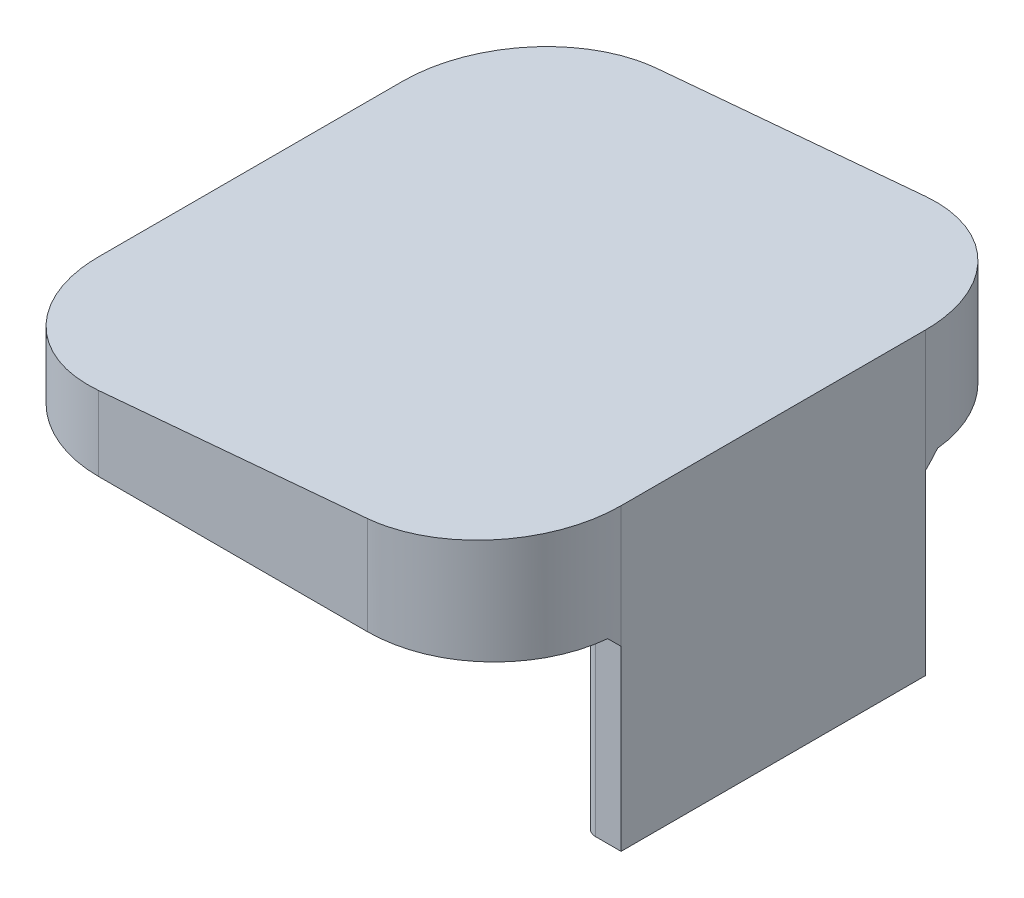
ISO-10303-21;
HEADER;
FILE_DESCRIPTION(('STEP AP214'),'2;1');
FILE_NAME('part.step','',(''),(''),'','','');
FILE_SCHEMA(('AUTOMOTIVE_DESIGN { 1 0 10303 214 1 1 1 1 }'));
ENDSEC;
DATA;
#1=APPLICATION_CONTEXT('core data for automotive mechanical design processes');
#2=APPLICATION_PROTOCOL_DEFINITION('international standard','automotive_design',2000,#1);
#3=PRODUCT_CONTEXT('',#1,'mechanical');
#4=PRODUCT('Part','Part','',(#3));
#5=PRODUCT_RELATED_PRODUCT_CATEGORY('part','',(#4));
#6=PRODUCT_DEFINITION_FORMATION('','',#4);
#7=PRODUCT_DEFINITION_CONTEXT('part definition',#1,'design');
#8=PRODUCT_DEFINITION('design','',#6,#7);
#9=PRODUCT_DEFINITION_SHAPE('','',#8);
#10=(LENGTH_UNIT() NAMED_UNIT(*) SI_UNIT(.MILLI.,.METRE.));
#11=(NAMED_UNIT(*) PLANE_ANGLE_UNIT() SI_UNIT($,.RADIAN.));
#12=(NAMED_UNIT(*) SI_UNIT($,.STERADIAN.) SOLID_ANGLE_UNIT());
#13=UNCERTAINTY_MEASURE_WITH_UNIT(LENGTH_MEASURE(1.E-05),#10,'distance_accuracy_value','');
#14=(GEOMETRIC_REPRESENTATION_CONTEXT(3) GLOBAL_UNCERTAINTY_ASSIGNED_CONTEXT((#13)) GLOBAL_UNIT_ASSIGNED_CONTEXT((#10,
#11,#12)) REPRESENTATION_CONTEXT('',''));
#15=CARTESIAN_POINT('',(0.,0.,0.));
#16=DIRECTION('',(0.,0.,1.));
#17=DIRECTION('',(1.,0.,0.));
#18=AXIS2_PLACEMENT_3D('',#15,#16,#17);
#19=CARTESIAN_POINT('',(-20.6,5.,44.));
#20=DIRECTION('',(1.,0.,0.));
#21=DIRECTION('',(0.,0.,-1.));
#22=AXIS2_PLACEMENT_3D('',#19,#20,#21);
#23=PLANE('',#22);
#24=DIRECTION('',(0.,0.,-1.));
#25=VECTOR('',#24,1.);
#26=CARTESIAN_POINT('',(-20.6,5.,44.));
#27=LINE('',#26,#25);
#28=CARTESIAN_POINT('',(-20.6,5.,34.));
#29=VERTEX_POINT('',#28);
#30=CARTESIAN_POINT('',(-20.6,5.,10.));
#31=VERTEX_POINT('',#30);
#32=EDGE_CURVE('E197',#29,#31,#27,.T.);
#33=ORIENTED_EDGE('',*,*,#32,.T.);
#34=DIRECTION('',(0.,-1.,0.));
#35=VECTOR('',#34,1.);
#36=CARTESIAN_POINT('',(-20.6,5.,10.));
#37=LINE('',#36,#35);
#38=CARTESIAN_POINT('',(-20.6,0.,10.));
#39=VERTEX_POINT('',#38);
#40=EDGE_CURVE('E212',#31,#39,#37,.T.);
#41=ORIENTED_EDGE('',*,*,#40,.T.);
#42=DIRECTION('',(0.,0.,-1.));
#43=VECTOR('',#42,1.);
#44=CARTESIAN_POINT('',(-20.6,0.,44.));
#45=LINE('',#44,#43);
#46=CARTESIAN_POINT('',(-20.6,0.,34.));
#47=VERTEX_POINT('',#46);
#48=EDGE_CURVE('E207',#47,#39,#45,.T.);
#49=ORIENTED_EDGE('',*,*,#48,.F.);
#50=DIRECTION('',(0.,-1.,0.));
#51=VECTOR('',#50,1.);
#52=CARTESIAN_POINT('',(-20.6,5.,34.));
#53=LINE('',#52,#51);
#54=EDGE_CURVE('E210',#47,#29,#53,.F.);
#55=ORIENTED_EDGE('',*,*,#54,.T.);
#56=EDGE_LOOP('',(#33,#41,#49,#55));
#57=FACE_BOUND('',#56,.T.);
#58=ADVANCED_FACE('F45',(#57),#23,.F.);
#59=CARTESIAN_POINT('',(-20.6,0.,44.));
#60=DIRECTION('',(0.,1.,0.));
#61=DIRECTION('',(0.,0.,1.));
#62=AXIS2_PLACEMENT_3D('',#59,#60,#61);
#63=PLANE('',#62);
#64=CARTESIAN_POINT('',(18.6,0.,33.));
#65=DIRECTION('',(0.,1.,0.));
#66=DIRECTION('',(0.,0.,1.));
#67=AXIS2_PLACEMENT_3D('',#64,#65,#66);
#68=CIRCLE('',#67,2.00000000000006);
#69=CARTESIAN_POINT('',(16.5999999999999,0.,33.));
#70=VERTEX_POINT('',#69);
#71=CARTESIAN_POINT('',(18.6,0.,35.0000000000001));
#72=VERTEX_POINT('',#71);
#73=EDGE_CURVE('E263',#70,#72,#68,.T.);
#74=ORIENTED_EDGE('',*,*,#73,.T.);
#75=DIRECTION('',(1.,0.,0.));
#76=VECTOR('',#75,1.);
#77=CARTESIAN_POINT('',(-20.6,0.,35.0000000000001));
#78=LINE('',#77,#76);
#79=CARTESIAN_POINT('',(20.5498743710662,0.,35.0000000000001));
#80=VERTEX_POINT('',#79);
#81=EDGE_CURVE('E265',#72,#80,#78,.T.);
#82=ORIENTED_EDGE('',*,*,#81,.T.);
#83=CARTESIAN_POINT('',(10.6,0.,34.));
#84=DIRECTION('',(0.,1.,0.));
#85=DIRECTION('',(0.,0.,1.));
#86=AXIS2_PLACEMENT_3D('',#83,#84,#85);
#87=CIRCLE('',#86,10.);
#88=CARTESIAN_POINT('',(10.6,0.,44.));
#89=VERTEX_POINT('',#88);
#90=EDGE_CURVE('E215',#80,#89,#87,.F.);
#91=ORIENTED_EDGE('',*,*,#90,.T.);
#92=DIRECTION('',(1.,0.,0.));
#93=VECTOR('',#92,1.);
#94=CARTESIAN_POINT('',(-20.6,0.,44.));
#95=LINE('',#94,#93);
#96=CARTESIAN_POINT('',(-10.6,0.,44.));
#97=VERTEX_POINT('',#96);
#98=EDGE_CURVE('E190',#97,#89,#95,.T.);
#99=ORIENTED_EDGE('',*,*,#98,.F.);
#100=CARTESIAN_POINT('',(-10.6,0.,34.));
#101=DIRECTION('',(0.,1.,0.));
#102=DIRECTION('',(0.,0.,1.));
#103=AXIS2_PLACEMENT_3D('',#100,#101,#102);
#104=CIRCLE('',#103,10.);
#105=EDGE_CURVE('E220',#97,#47,#104,.F.);
#106=ORIENTED_EDGE('',*,*,#105,.T.);
#107=ORIENTED_EDGE('',*,*,#48,.T.);
#108=CARTESIAN_POINT('',(-10.6,0.,10.));
#109=DIRECTION('',(0.,1.,0.));
#110=DIRECTION('',(0.,0.,1.));
#111=AXIS2_PLACEMENT_3D('',#108,#109,#110);
#112=CIRCLE('',#111,10.);
#113=CARTESIAN_POINT('',(-10.6,0.,0.));
#114=VERTEX_POINT('',#113);
#115=EDGE_CURVE('E222',#39,#114,#112,.F.);
#116=ORIENTED_EDGE('',*,*,#115,.T.);
#117=DIRECTION('',(1.,0.,0.));
#118=VECTOR('',#117,1.);
#119=CARTESIAN_POINT('',(-20.6,0.,0.));
#120=LINE('',#119,#118);
#121=CARTESIAN_POINT('',(10.6,0.,0.));
#122=VERTEX_POINT('',#121);
#123=EDGE_CURVE('E180',#114,#122,#120,.T.);
#124=ORIENTED_EDGE('',*,*,#123,.T.);
#125=CARTESIAN_POINT('',(10.6,0.,10.));
#126=DIRECTION('',(0.,1.,0.));
#127=DIRECTION('',(0.,0.,1.));
#128=AXIS2_PLACEMENT_3D('',#125,#126,#127);
#129=CIRCLE('',#128,10.);
#130=CARTESIAN_POINT('',(20.5498743710662,0.,8.99999999999993));
#131=VERTEX_POINT('',#130);
#132=EDGE_CURVE('E217',#122,#131,#129,.F.);
#133=ORIENTED_EDGE('',*,*,#132,.T.);
#134=DIRECTION('',(-1.,0.,0.));
#135=VECTOR('',#134,1.);
#136=CARTESIAN_POINT('',(18.6,0.,8.99999999999993));
#137=LINE('',#136,#135);
#138=CARTESIAN_POINT('',(18.6,0.,8.99999999999993));
#139=VERTEX_POINT('',#138);
#140=EDGE_CURVE('E257',#131,#139,#137,.T.);
#141=ORIENTED_EDGE('',*,*,#140,.T.);
#142=CARTESIAN_POINT('',(18.6,0.,11.));
#143=DIRECTION('',(0.,1.,0.));
#144=DIRECTION('',(0.,0.,1.));
#145=AXIS2_PLACEMENT_3D('',#142,#143,#144);
#146=CIRCLE('',#145,2.00000000000006);
#147=CARTESIAN_POINT('',(16.5999999999999,0.,11.));
#148=VERTEX_POINT('',#147);
#149=EDGE_CURVE('E259',#139,#148,#146,.T.);
#150=ORIENTED_EDGE('',*,*,#149,.T.);
#151=DIRECTION('',(0.,0.,1.));
#152=VECTOR('',#151,1.);
#153=CARTESIAN_POINT('',(16.5999999999999,0.,44.));
#154=LINE('',#153,#152);
#155=EDGE_CURVE('E261',#148,#70,#154,.T.);
#156=ORIENTED_EDGE('',*,*,#155,.T.);
#157=EDGE_LOOP('',(#74,#82,#91,#99,#106,#107,#116,#124,#133,#141,#150,#156));
#158=FACE_BOUND('',#157,.T.);
#159=ADVANCED_FACE('F316',(#158),#63,.F.);
#160=CARTESIAN_POINT('',(20.6,0.,44.));
#161=DIRECTION('',(-1.,0.,0.));
#162=DIRECTION('',(0.,0.,1.));
#163=AXIS2_PLACEMENT_3D('',#160,#161,#162);
#164=PLANE('',#163);
#165=DIRECTION('',(0.,1.,0.));
#166=VECTOR('',#165,1.);
#167=CARTESIAN_POINT('',(20.6,0.,34.));
#168=LINE('',#167,#166);
#169=CARTESIAN_POINT('',(20.6,8.60453293726822,34.));
#170=VERTEX_POINT('',#169);
#171=CARTESIAN_POINT('',(20.6,-1.00000000000007,34.));
#172=VERTEX_POINT('',#171);
#173=EDGE_CURVE('E63',#170,#172,#168,.F.);
#174=ORIENTED_EDGE('',*,*,#173,.T.);
#175=DIRECTION('',(0.,1.,0.));
#176=VECTOR('',#175,1.);
#177=CARTESIAN_POINT('',(20.6,-15.0000000000001,34.));
#178=LINE('',#177,#176);
#179=CARTESIAN_POINT('',(20.6,-15.0000000000001,34.));
#180=VERTEX_POINT('',#179);
#181=EDGE_CURVE('E181',#180,#172,#178,.T.);
#182=ORIENTED_EDGE('',*,*,#181,.F.);
#183=DIRECTION('',(0.,0.,1.));
#184=VECTOR('',#183,1.);
#185=CARTESIAN_POINT('',(20.6,-15.0000000000001,0.));
#186=LINE('',#185,#184);
#187=CARTESIAN_POINT('',(20.6,-15.0000000000001,10.));
#188=VERTEX_POINT('',#187);
#189=EDGE_CURVE('E163',#188,#180,#186,.T.);
#190=ORIENTED_EDGE('',*,*,#189,.F.);
#191=DIRECTION('',(0.,1.,0.));
#192=VECTOR('',#191,1.);
#193=CARTESIAN_POINT('',(20.6,-15.0000000000001,10.));
#194=LINE('',#193,#192);
#195=CARTESIAN_POINT('',(20.6,-1.00000000000007,10.));
#196=VERTEX_POINT('',#195);
#197=EDGE_CURVE('E174',#188,#196,#194,.T.);
#198=ORIENTED_EDGE('',*,*,#197,.T.);
#199=DIRECTION('',(0.,1.,0.));
#200=VECTOR('',#199,1.);
#201=CARTESIAN_POINT('',(20.6,0.,10.));
#202=LINE('',#201,#200);
#203=CARTESIAN_POINT('',(20.6,8.60453293726822,10.));
#204=VERTEX_POINT('',#203);
#205=EDGE_CURVE('E243',#196,#204,#202,.T.);
#206=ORIENTED_EDGE('',*,*,#205,.T.);
#207=DIRECTION('',(0.,0.,-1.));
#208=VECTOR('',#207,1.);
#209=CARTESIAN_POINT('',(20.6,8.60453293726822,44.));
#210=LINE('',#209,#208);
#211=EDGE_CURVE('E204',#170,#204,#210,.T.);
#212=ORIENTED_EDGE('',*,*,#211,.F.);
#213=EDGE_LOOP('',(#174,#182,#190,#198,#206,#212));
#214=FACE_BOUND('',#213,.T.);
#215=ADVANCED_FACE('F183',(#214),#164,.F.);
#216=CARTESIAN_POINT('',(20.6,8.60453293726822,44.));
#217=DIRECTION('',(0.0871557427476618,-0.996194698091745,0.));
#218=DIRECTION('',(0.996194698091745,0.0871557427476618,0.));
#219=AXIS2_PLACEMENT_3D('',#216,#217,#218);
#220=PLANE('',#219);
#221=DIRECTION('',(-0.996194698091745,-0.0871557427476618,0.));
#222=VECTOR('',#221,1.);
#223=CARTESIAN_POINT('',(20.6,8.60453293726822,0.));
#224=LINE('',#223,#222);
#225=CARTESIAN_POINT('',(10.6,7.72964630200894,0.));
#226=VERTEX_POINT('',#225);
#227=CARTESIAN_POINT('',(-10.6,5.87488663525928,0.));
#228=VERTEX_POINT('',#227);
#229=EDGE_CURVE('E194',#226,#228,#224,.T.);
#230=ORIENTED_EDGE('',*,*,#229,.T.);
#231=CARTESIAN_POINT('',(-10.6,5.87488663525928,10.));
#232=DIRECTION('',(0.0871557427476618,-0.996194698091745,0.));
#233=DIRECTION('',(-0.996194698091745,-0.0871557427476618,0.));
#234=AXIS2_PLACEMENT_3D('',#231,#232,#233);
#235=ELLIPSE('',#234,10.0381983754335,10.);
#236=EDGE_CURVE('E234',#228,#31,#235,.F.);
#237=ORIENTED_EDGE('',*,*,#236,.T.);
#238=ORIENTED_EDGE('',*,*,#32,.F.);
#239=CARTESIAN_POINT('',(-10.6,5.87488663525928,34.));
#240=DIRECTION('',(0.0871557427476618,-0.996194698091745,0.));
#241=DIRECTION('',(0.996194698091745,0.0871557427476618,0.));
#242=AXIS2_PLACEMENT_3D('',#239,#240,#241);
#243=ELLIPSE('',#242,10.0381983754335,10.);
#244=CARTESIAN_POINT('',(-10.6,5.87488663525928,44.));
#245=VERTEX_POINT('',#244);
#246=EDGE_CURVE('E232',#29,#245,#243,.F.);
#247=ORIENTED_EDGE('',*,*,#246,.T.);
#248=DIRECTION('',(-0.996194698091745,-0.0871557427476618,0.));
#249=VECTOR('',#248,1.);
#250=CARTESIAN_POINT('',(20.6,8.60453293726822,44.));
#251=LINE('',#250,#249);
#252=CARTESIAN_POINT('',(10.6,7.72964630200894,44.));
#253=VERTEX_POINT('',#252);
#254=EDGE_CURVE('E193',#253,#245,#251,.T.);
#255=ORIENTED_EDGE('',*,*,#254,.F.);
#256=CARTESIAN_POINT('',(10.6,7.72964630200894,34.));
#257=DIRECTION('',(0.0871557427476618,-0.996194698091745,0.));
#258=DIRECTION('',(-0.996194698091745,-0.0871557427476618,0.));
#259=AXIS2_PLACEMENT_3D('',#256,#257,#258);
#260=ELLIPSE('',#259,10.0381983754335,10.);
#261=EDGE_CURVE('E228',#253,#170,#260,.F.);
#262=ORIENTED_EDGE('',*,*,#261,.T.);
#263=ORIENTED_EDGE('',*,*,#211,.T.);
#264=CARTESIAN_POINT('',(10.6,7.72964630200894,10.));
#265=DIRECTION('',(0.0871557427476618,-0.996194698091745,0.));
#266=DIRECTION('',(0.996194698091745,0.0871557427476618,0.));
#267=AXIS2_PLACEMENT_3D('',#264,#265,#266);
#268=ELLIPSE('',#267,10.0381983754335,10.);
#269=EDGE_CURVE('E230',#204,#226,#268,.F.);
#270=ORIENTED_EDGE('',*,*,#269,.T.);
#271=EDGE_LOOP('',(#230,#237,#238,#247,#255,#262,#263,#270));
#272=FACE_BOUND('',#271,.T.);
#273=ADVANCED_FACE('F326',(#272),#220,.F.);
#274=CARTESIAN_POINT('',(0.,0.,44.));
#275=DIRECTION('',(0.,0.,1.));
#276=DIRECTION('',(1.,0.,0.));
#277=AXIS2_PLACEMENT_3D('',#274,#275,#276);
#278=PLANE('',#277);
#279=ORIENTED_EDGE('',*,*,#254,.T.);
#280=DIRECTION('',(0.,-1.,0.));
#281=VECTOR('',#280,1.);
#282=CARTESIAN_POINT('',(-10.6,0.,44.));
#283=LINE('',#282,#281);
#284=EDGE_CURVE('E239',#245,#97,#283,.T.);
#285=ORIENTED_EDGE('',*,*,#284,.T.);
#286=ORIENTED_EDGE('',*,*,#98,.T.);
#287=DIRECTION('',(0.,1.,0.));
#288=VECTOR('',#287,1.);
#289=CARTESIAN_POINT('',(10.6,8.60453293726822,44.));
#290=LINE('',#289,#288);
#291=EDGE_CURVE('E236',#89,#253,#290,.T.);
#292=ORIENTED_EDGE('',*,*,#291,.T.);
#293=EDGE_LOOP('',(#279,#285,#286,#292));
#294=FACE_BOUND('',#293,.T.);
#295=ADVANCED_FACE('F323',(#294),#278,.T.);
#296=CARTESIAN_POINT('',(0.,0.,0.));
#297=DIRECTION('',(0.,0.,1.));
#298=DIRECTION('',(1.,0.,0.));
#299=AXIS2_PLACEMENT_3D('',#296,#297,#298);
#300=PLANE('',#299);
#301=ORIENTED_EDGE('',*,*,#123,.F.);
#302=DIRECTION('',(0.,-1.,0.));
#303=VECTOR('',#302,1.);
#304=CARTESIAN_POINT('',(-10.6,0.,0.));
#305=LINE('',#304,#303);
#306=EDGE_CURVE('E226',#114,#228,#305,.F.);
#307=ORIENTED_EDGE('',*,*,#306,.T.);
#308=ORIENTED_EDGE('',*,*,#229,.F.);
#309=DIRECTION('',(0.,1.,0.));
#310=VECTOR('',#309,1.);
#311=CARTESIAN_POINT('',(10.6,0.,0.));
#312=LINE('',#311,#310);
#313=EDGE_CURVE('E224',#226,#122,#312,.F.);
#314=ORIENTED_EDGE('',*,*,#313,.T.);
#315=EDGE_LOOP('',(#301,#307,#308,#314));
#316=FACE_BOUND('',#315,.T.);
#317=ADVANCED_FACE('F342',(#316),#300,.F.);
#318=CARTESIAN_POINT('',(-10.6,5.,10.));
#319=DIRECTION('',(0.,-1.,0.));
#320=DIRECTION('',(0.,0.,-1.));
#321=AXIS2_PLACEMENT_3D('',#318,#319,#320);
#322=CYLINDRICAL_SURFACE('',#321,10.);
#323=ORIENTED_EDGE('',*,*,#236,.F.);
#324=ORIENTED_EDGE('',*,*,#306,.F.);
#325=ORIENTED_EDGE('',*,*,#115,.F.);
#326=ORIENTED_EDGE('',*,*,#40,.F.);
#327=EDGE_LOOP('',(#323,#324,#325,#326));
#328=FACE_BOUND('',#327,.T.);
#329=ADVANCED_FACE('F337',(#328),#322,.T.);
#330=CARTESIAN_POINT('',(-10.6,0.,34.));
#331=DIRECTION('',(0.,1.,0.));
#332=DIRECTION('',(0.,0.,1.));
#333=AXIS2_PLACEMENT_3D('',#330,#331,#332);
#334=CYLINDRICAL_SURFACE('',#333,10.);
#335=ORIENTED_EDGE('',*,*,#246,.F.);
#336=ORIENTED_EDGE('',*,*,#54,.F.);
#337=ORIENTED_EDGE('',*,*,#105,.F.);
#338=ORIENTED_EDGE('',*,*,#284,.F.);
#339=EDGE_LOOP('',(#335,#336,#337,#338));
#340=FACE_BOUND('',#339,.T.);
#341=ADVANCED_FACE('F331',(#340),#334,.T.);
#342=CARTESIAN_POINT('',(10.6,0.,10.));
#343=DIRECTION('',(0.,1.,0.));
#344=DIRECTION('',(0.,0.,1.));
#345=AXIS2_PLACEMENT_3D('',#342,#343,#344);
#346=CYLINDRICAL_SURFACE('',#345,10.);
#347=ORIENTED_EDGE('',*,*,#132,.F.);
#348=ORIENTED_EDGE('',*,*,#313,.F.);
#349=ORIENTED_EDGE('',*,*,#269,.F.);
#350=ORIENTED_EDGE('',*,*,#205,.F.);
#351=CARTESIAN_POINT('',(10.6,-1.00000000000008,10.));
#352=DIRECTION('',(0.,-0.707106781186546,-0.707106781186549));
#353=DIRECTION('',(0.,0.707106781186549,-0.707106781186546));
#354=AXIS2_PLACEMENT_3D('',#351,#352,#353);
#355=ELLIPSE('',#354,14.142135623731,10.);
#356=EDGE_CURVE('E11',#196,#131,#355,.F.);
#357=ORIENTED_EDGE('',*,*,#356,.T.);
#358=EDGE_LOOP('',(#347,#348,#349,#350,#357));
#359=FACE_BOUND('',#358,.T.);
#360=ADVANCED_FACE('F346',(#359),#346,.T.);
#361=CARTESIAN_POINT('',(10.6,0.,34.));
#362=DIRECTION('',(0.,-1.,0.));
#363=DIRECTION('',(0.,0.,-1.));
#364=AXIS2_PLACEMENT_3D('',#361,#362,#363);
#365=CYLINDRICAL_SURFACE('',#364,10.);
#366=ORIENTED_EDGE('',*,*,#90,.F.);
#367=CARTESIAN_POINT('',(10.6,-1.00000000000007,34.));
#368=DIRECTION('',(0.,0.707106781186545,-0.70710678118655));
#369=DIRECTION('',(0.,-0.70710678118655,-0.707106781186545));
#370=AXIS2_PLACEMENT_3D('',#367,#368,#369);
#371=ELLIPSE('',#370,14.142135623731,10.);
#372=EDGE_CURVE('E56',#80,#172,#371,.T.);
#373=ORIENTED_EDGE('',*,*,#372,.T.);
#374=ORIENTED_EDGE('',*,*,#173,.F.);
#375=ORIENTED_EDGE('',*,*,#261,.F.);
#376=ORIENTED_EDGE('',*,*,#291,.F.);
#377=EDGE_LOOP('',(#366,#373,#374,#375,#376));
#378=FACE_BOUND('',#377,.T.);
#379=ADVANCED_FACE('F320',(#378),#365,.T.);
#380=CARTESIAN_POINT('',(17.6,-15.0000000000001,0.));
#381=DIRECTION('',(-1.,0.,0.));
#382=DIRECTION('',(0.,-1.,0.));
#383=AXIS2_PLACEMENT_3D('',#380,#381,#382);
#384=PLANE('',#383);
#385=DIRECTION('',(0.,1.,0.));
#386=VECTOR('',#385,1.);
#387=CARTESIAN_POINT('',(17.6,-15.0000000000001,33.));
#388=LINE('',#387,#386);
#389=CARTESIAN_POINT('',(17.6,-15.0000000000001,33.));
#390=VERTEX_POINT('',#389);
#391=CARTESIAN_POINT('',(17.6,-1.00000000000007,33.));
#392=VERTEX_POINT('',#391);
#393=EDGE_CURVE('E247',#390,#392,#388,.T.);
#394=ORIENTED_EDGE('',*,*,#393,.T.);
#395=DIRECTION('',(0.,0.,-1.));
#396=VECTOR('',#395,1.);
#397=CARTESIAN_POINT('',(17.6,-1.00000000000007,0.));
#398=LINE('',#397,#396);
#399=CARTESIAN_POINT('',(17.6,-1.00000000000007,11.));
#400=VERTEX_POINT('',#399);
#401=EDGE_CURVE('E272',#392,#400,#398,.T.);
#402=ORIENTED_EDGE('',*,*,#401,.T.);
#403=DIRECTION('',(0.,1.,0.));
#404=VECTOR('',#403,1.);
#405=CARTESIAN_POINT('',(17.6,-15.0000000000001,11.));
#406=LINE('',#405,#404);
#407=CARTESIAN_POINT('',(17.6,-15.0000000000001,11.));
#408=VERTEX_POINT('',#407);
#409=EDGE_CURVE('E245',#400,#408,#406,.F.);
#410=ORIENTED_EDGE('',*,*,#409,.T.);
#411=DIRECTION('',(0.,0.,1.));
#412=VECTOR('',#411,1.);
#413=CARTESIAN_POINT('',(17.6,-15.0000000000001,0.));
#414=LINE('',#413,#412);
#415=EDGE_CURVE('E170',#408,#390,#414,.T.);
#416=ORIENTED_EDGE('',*,*,#415,.T.);
#417=EDGE_LOOP('',(#394,#402,#410,#416));
#418=FACE_BOUND('',#417,.T.);
#419=ADVANCED_FACE('F298',(#418),#384,.T.);
#420=CARTESIAN_POINT('',(0.,-15.,9.99999999999999));
#421=DIRECTION('',(0.,0.,1.));
#422=DIRECTION('',(1.,0.,0.));
#423=AXIS2_PLACEMENT_3D('',#420,#421,#422);
#424=PLANE('',#423);
#425=DIRECTION('',(0.,1.,0.));
#426=VECTOR('',#425,1.);
#427=CARTESIAN_POINT('',(18.6,0.,10.));
#428=LINE('',#427,#426);
#429=CARTESIAN_POINT('',(18.6,-15.0000000000001,10.));
#430=VERTEX_POINT('',#429);
#431=CARTESIAN_POINT('',(18.6,-1.00000000000007,10.));
#432=VERTEX_POINT('',#431);
#433=EDGE_CURVE('E255',#430,#432,#428,.T.);
#434=ORIENTED_EDGE('',*,*,#433,.T.);
#435=DIRECTION('',(1.,0.,0.));
#436=VECTOR('',#435,1.);
#437=CARTESIAN_POINT('',(20.6,-1.00000000000007,10.));
#438=LINE('',#437,#436);
#439=EDGE_CURVE('E177',#432,#196,#438,.T.);
#440=ORIENTED_EDGE('',*,*,#439,.T.);
#441=ORIENTED_EDGE('',*,*,#197,.F.);
#442=DIRECTION('',(1.,0.,0.));
#443=VECTOR('',#442,1.);
#444=CARTESIAN_POINT('',(0.,-15.,9.99999999999999));
#445=LINE('',#444,#443);
#446=EDGE_CURVE('E158',#430,#188,#445,.T.);
#447=ORIENTED_EDGE('',*,*,#446,.F.);
#448=EDGE_LOOP('',(#434,#440,#441,#447));
#449=FACE_BOUND('',#448,.T.);
#450=ADVANCED_FACE('F175',(#449),#424,.F.);
#451=CARTESIAN_POINT('',(0.,-15.,34.));
#452=DIRECTION('',(0.,0.,1.));
#453=DIRECTION('',(1.,0.,0.));
#454=AXIS2_PLACEMENT_3D('',#451,#452,#453);
#455=PLANE('',#454);
#456=ORIENTED_EDGE('',*,*,#181,.T.);
#457=DIRECTION('',(-1.,0.,0.));
#458=VECTOR('',#457,1.);
#459=CARTESIAN_POINT('',(0.,-1.00000000000007,34.));
#460=LINE('',#459,#458);
#461=CARTESIAN_POINT('',(18.6,-1.00000000000007,34.));
#462=VERTEX_POINT('',#461);
#463=EDGE_CURVE('E268',#172,#462,#460,.T.);
#464=ORIENTED_EDGE('',*,*,#463,.T.);
#465=DIRECTION('',(0.,1.,0.));
#466=VECTOR('',#465,1.);
#467=CARTESIAN_POINT('',(18.6,-15.0000000000001,34.));
#468=LINE('',#467,#466);
#469=CARTESIAN_POINT('',(18.6,-15.0000000000001,34.));
#470=VERTEX_POINT('',#469);
#471=EDGE_CURVE('E250',#462,#470,#468,.F.);
#472=ORIENTED_EDGE('',*,*,#471,.T.);
#473=DIRECTION('',(1.,0.,0.));
#474=VECTOR('',#473,1.);
#475=CARTESIAN_POINT('',(0.,-15.,34.));
#476=LINE('',#475,#474);
#477=EDGE_CURVE('E184',#470,#180,#476,.T.);
#478=ORIENTED_EDGE('',*,*,#477,.T.);
#479=EDGE_LOOP('',(#456,#464,#472,#478));
#480=FACE_BOUND('',#479,.T.);
#481=ADVANCED_FACE('F383',(#480),#455,.T.);
#482=CARTESIAN_POINT('',(0.,-15.,0.));
#483=DIRECTION('',(0.,-1.,0.));
#484=DIRECTION('',(1.,0.,0.));
#485=AXIS2_PLACEMENT_3D('',#482,#483,#484);
#486=PLANE('',#485);
#487=ORIENTED_EDGE('',*,*,#477,.F.);
#488=CARTESIAN_POINT('',(18.6,-15.0000000000001,33.));
#489=DIRECTION('',(0.,-1.,0.));
#490=DIRECTION('',(1.,0.,0.));
#491=AXIS2_PLACEMENT_3D('',#488,#489,#490);
#492=CIRCLE('',#491,1.);
#493=EDGE_CURVE('E253',#470,#390,#492,.T.);
#494=ORIENTED_EDGE('',*,*,#493,.T.);
#495=ORIENTED_EDGE('',*,*,#415,.F.);
#496=CARTESIAN_POINT('',(18.6,-15.0000000000001,11.));
#497=DIRECTION('',(0.,-1.,0.));
#498=DIRECTION('',(1.,0.,0.));
#499=AXIS2_PLACEMENT_3D('',#496,#497,#498);
#500=CIRCLE('',#499,1.);
#501=EDGE_CURVE('E166',#408,#430,#500,.T.);
#502=ORIENTED_EDGE('',*,*,#501,.T.);
#503=ORIENTED_EDGE('',*,*,#446,.T.);
#504=ORIENTED_EDGE('',*,*,#189,.T.);
#505=EDGE_LOOP('',(#487,#494,#495,#502,#503,#504));
#506=FACE_BOUND('',#505,.T.);
#507=ADVANCED_FACE('F161',(#506),#486,.T.);
#508=CARTESIAN_POINT('',(18.6,-15.0000000000001,33.));
#509=DIRECTION('',(0.,1.,0.));
#510=DIRECTION('',(-1.,0.,0.));
#511=AXIS2_PLACEMENT_3D('',#508,#509,#510);
#512=CYLINDRICAL_SURFACE('',#511,1.);
#513=ORIENTED_EDGE('',*,*,#471,.F.);
#514=CARTESIAN_POINT('',(18.6,-1.00000000000007,33.));
#515=DIRECTION('',(0.,1.,0.));
#516=DIRECTION('',(0.,0.,1.));
#517=AXIS2_PLACEMENT_3D('',#514,#515,#516);
#518=CIRCLE('',#517,1.);
#519=EDGE_CURVE('E270',#462,#392,#518,.F.);
#520=ORIENTED_EDGE('',*,*,#519,.T.);
#521=ORIENTED_EDGE('',*,*,#393,.F.);
#522=ORIENTED_EDGE('',*,*,#493,.F.);
#523=EDGE_LOOP('',(#513,#520,#521,#522));
#524=FACE_BOUND('',#523,.T.);
#525=ADVANCED_FACE('F303',(#524),#512,.T.);
#526=CARTESIAN_POINT('',(18.6,-15.0000000000001,11.));
#527=DIRECTION('',(0.,-1.,0.));
#528=DIRECTION('',(1.,0.,0.));
#529=AXIS2_PLACEMENT_3D('',#526,#527,#528);
#530=CYLINDRICAL_SURFACE('',#529,1.);
#531=ORIENTED_EDGE('',*,*,#409,.F.);
#532=CARTESIAN_POINT('',(18.6,-1.00000000000007,11.));
#533=DIRECTION('',(0.,1.,0.));
#534=DIRECTION('',(0.,0.,1.));
#535=AXIS2_PLACEMENT_3D('',#532,#533,#534);
#536=CIRCLE('',#535,1.);
#537=EDGE_CURVE('E274',#400,#432,#536,.F.);
#538=ORIENTED_EDGE('',*,*,#537,.T.);
#539=ORIENTED_EDGE('',*,*,#433,.F.);
#540=ORIENTED_EDGE('',*,*,#501,.F.);
#541=EDGE_LOOP('',(#531,#538,#539,#540));
#542=FACE_BOUND('',#541,.T.);
#543=ADVANCED_FACE('F352',(#542),#530,.T.);
#544=CARTESIAN_POINT('',(0.,-1.00000000000007,9.99999999999999));
#545=DIRECTION('',(0.,-0.707106781186546,-0.707106781186549));
#546=DIRECTION('',(-1.,0.,0.));
#547=AXIS2_PLACEMENT_3D('',#544,#545,#546);
#548=PLANE('',#547);
#549=ORIENTED_EDGE('',*,*,#356,.F.);
#550=ORIENTED_EDGE('',*,*,#439,.F.);
#551=DIRECTION('',(0.,-0.707106781186549,0.707106781186546));
#552=VECTOR('',#551,1.);
#553=CARTESIAN_POINT('',(18.6,0.,8.99999999999993));
#554=LINE('',#553,#552);
#555=EDGE_CURVE('E50',#139,#432,#554,.T.);
#556=ORIENTED_EDGE('',*,*,#555,.F.);
#557=ORIENTED_EDGE('',*,*,#140,.F.);
#558=EDGE_LOOP('',(#549,#550,#556,#557));
#559=FACE_BOUND('',#558,.T.);
#560=ADVANCED_FACE('F48',(#559),#548,.T.);
#561=CARTESIAN_POINT('',(18.6,0.,11.));
#562=DIRECTION('',(0.,1.,0.));
#563=DIRECTION('',(0.,0.,1.));
#564=AXIS2_PLACEMENT_3D('',#561,#562,#563);
#565=CONICAL_SURFACE('',#564,2.00000000000006,0.785398163397445);
#566=ORIENTED_EDGE('',*,*,#555,.T.);
#567=ORIENTED_EDGE('',*,*,#537,.F.);
#568=DIRECTION('',(0.707106781186545,-0.70710678118655,0.));
#569=VECTOR('',#568,1.);
#570=CARTESIAN_POINT('',(16.5999999999999,0.,11.));
#571=LINE('',#570,#569);
#572=EDGE_CURVE('E284',#148,#400,#571,.T.);
#573=ORIENTED_EDGE('',*,*,#572,.F.);
#574=ORIENTED_EDGE('',*,*,#149,.F.);
#575=EDGE_LOOP('',(#566,#567,#573,#574));
#576=FACE_BOUND('',#575,.T.);
#577=ADVANCED_FACE('F349',(#576),#565,.T.);
#578=CARTESIAN_POINT('',(16.5999999999999,0.,44.));
#579=DIRECTION('',(0.70710678118655,0.707106781186545,0.));
#580=DIRECTION('',(0.,0.,1.));
#581=AXIS2_PLACEMENT_3D('',#578,#579,#580);
#582=PLANE('',#581);
#583=ORIENTED_EDGE('',*,*,#572,.T.);
#584=ORIENTED_EDGE('',*,*,#401,.F.);
#585=DIRECTION('',(0.707106781186546,-0.707106781186549,0.));
#586=VECTOR('',#585,1.);
#587=CARTESIAN_POINT('',(16.5999999999999,0.,33.));
#588=LINE('',#587,#586);
#589=EDGE_CURVE('E282',#70,#392,#588,.T.);
#590=ORIENTED_EDGE('',*,*,#589,.F.);
#591=ORIENTED_EDGE('',*,*,#155,.F.);
#592=EDGE_LOOP('',(#583,#584,#590,#591));
#593=FACE_BOUND('',#592,.T.);
#594=ADVANCED_FACE('F350',(#593),#582,.F.);
#595=CARTESIAN_POINT('',(18.6,0.,33.));
#596=DIRECTION('',(0.,1.,0.));
#597=DIRECTION('',(0.,0.,1.));
#598=AXIS2_PLACEMENT_3D('',#595,#596,#597);
#599=CONICAL_SURFACE('',#598,2.00000000000007,0.785398163397444);
#600=ORIENTED_EDGE('',*,*,#589,.T.);
#601=ORIENTED_EDGE('',*,*,#519,.F.);
#602=DIRECTION('',(0.,-0.707106781186551,-0.707106781186544));
#603=VECTOR('',#602,1.);
#604=CARTESIAN_POINT('',(18.6,0.,35.0000000000001));
#605=LINE('',#604,#603);
#606=EDGE_CURVE('E279',#72,#462,#605,.T.);
#607=ORIENTED_EDGE('',*,*,#606,.F.);
#608=ORIENTED_EDGE('',*,*,#73,.F.);
#609=EDGE_LOOP('',(#600,#601,#607,#608));
#610=FACE_BOUND('',#609,.T.);
#611=ADVANCED_FACE('F307',(#610),#599,.T.);
#612=CARTESIAN_POINT('',(-20.6,0.,35.0000000000001));
#613=DIRECTION('',(0.,0.707106781186545,-0.70710678118655));
#614=DIRECTION('',(1.,0.,0.));
#615=AXIS2_PLACEMENT_3D('',#612,#613,#614);
#616=PLANE('',#615);
#617=ORIENTED_EDGE('',*,*,#606,.T.);
#618=ORIENTED_EDGE('',*,*,#463,.F.);
#619=ORIENTED_EDGE('',*,*,#372,.F.);
#620=ORIENTED_EDGE('',*,*,#81,.F.);
#621=EDGE_LOOP('',(#617,#618,#619,#620));
#622=FACE_BOUND('',#621,.T.);
#623=ADVANCED_FACE('F313',(#622),#616,.F.);
#624=CLOSED_SHELL('',(#58,#159,#215,#273,#295,#317,#329,#341,#360,#379,#419,#450,#481,#507,#525,
#543,#560,#577,#594,#611,#623));
#625=MANIFOLD_SOLID_BREP('B2',#624);
#626=ADVANCED_BREP_SHAPE_REPRESENTATION('',(#18,#625),#14);
#627=SHAPE_DEFINITION_REPRESENTATION(#9,#626);
ENDSEC;
END-ISO-10303-21;
